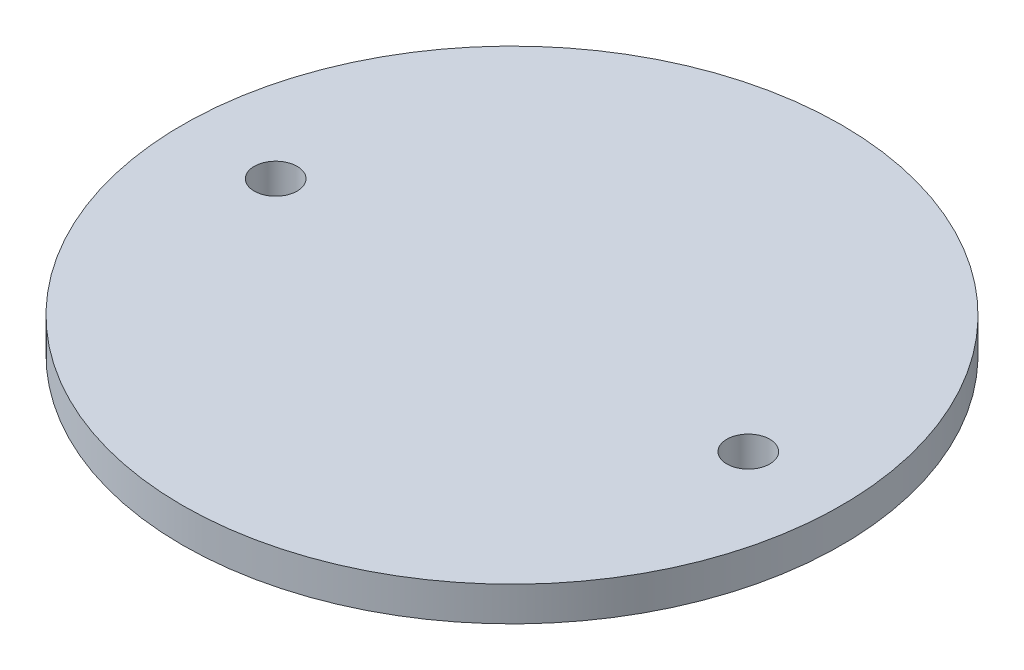
ISO-10303-21;
HEADER;
FILE_DESCRIPTION(('STEP AP214'),'2;1');
FILE_NAME('part.step','',(''),(''),'','','');
FILE_SCHEMA(('AUTOMOTIVE_DESIGN { 1 0 10303 214 1 1 1 1 }'));
ENDSEC;
DATA;
#1=APPLICATION_CONTEXT('core data for automotive mechanical design processes');
#2=APPLICATION_PROTOCOL_DEFINITION('international standard','automotive_design',2000,#1);
#3=PRODUCT_CONTEXT('',#1,'mechanical');
#4=PRODUCT('Part','Part','',(#3));
#5=PRODUCT_RELATED_PRODUCT_CATEGORY('part','',(#4));
#6=PRODUCT_DEFINITION_FORMATION('','',#4);
#7=PRODUCT_DEFINITION_CONTEXT('part definition',#1,'design');
#8=PRODUCT_DEFINITION('design','',#6,#7);
#9=PRODUCT_DEFINITION_SHAPE('','',#8);
#10=(LENGTH_UNIT() NAMED_UNIT(*) SI_UNIT(.MILLI.,.METRE.));
#11=(NAMED_UNIT(*) PLANE_ANGLE_UNIT() SI_UNIT($,.RADIAN.));
#12=(NAMED_UNIT(*) SI_UNIT($,.STERADIAN.) SOLID_ANGLE_UNIT());
#13=UNCERTAINTY_MEASURE_WITH_UNIT(LENGTH_MEASURE(1.E-05),#10,'distance_accuracy_value','');
#14=(GEOMETRIC_REPRESENTATION_CONTEXT(3) GLOBAL_UNCERTAINTY_ASSIGNED_CONTEXT((#13)) GLOBAL_UNIT_ASSIGNED_CONTEXT((#10,
#11,#12)) REPRESENTATION_CONTEXT('',''));
#15=CARTESIAN_POINT('',(0.,0.,0.));
#16=DIRECTION('',(0.,0.,1.));
#17=DIRECTION('',(1.,0.,0.));
#18=AXIS2_PLACEMENT_3D('',#15,#16,#17);
#19=CARTESIAN_POINT('',(0.,4.,0.));
#20=DIRECTION('',(0.,1.,0.));
#21=DIRECTION('',(0.,0.,1.));
#22=AXIS2_PLACEMENT_3D('',#19,#20,#21);
#23=PLANE('',#22);
#24=CARTESIAN_POINT('',(-27.5,4.,0.));
#25=DIRECTION('',(0.,1.,0.));
#26=DIRECTION('',(0.,0.,1.));
#27=AXIS2_PLACEMENT_3D('',#24,#25,#26);
#28=CIRCLE('',#27,2.5);
#29=CARTESIAN_POINT('',(-27.5,4.,2.5));
#30=VERTEX_POINT('',#29);
#31=EDGE_CURVE('E41',#30,#30,#28,.T.);
#32=ORIENTED_EDGE('',*,*,#31,.F.);
#33=EDGE_LOOP('',(#32));
#34=FACE_BOUND('',#33,.T.);
#35=CARTESIAN_POINT('',(0.,4.,0.));
#36=DIRECTION('',(0.,1.,0.));
#37=DIRECTION('',(0.,0.,1.));
#38=AXIS2_PLACEMENT_3D('',#35,#36,#37);
#39=CIRCLE('',#38,38.35);
#40=CARTESIAN_POINT('',(0.,4.,38.35));
#41=VERTEX_POINT('',#40);
#42=EDGE_CURVE('E10',#41,#41,#39,.T.);
#43=ORIENTED_EDGE('',*,*,#42,.T.);
#44=EDGE_LOOP('',(#43));
#45=FACE_BOUND('',#44,.T.);
#46=CARTESIAN_POINT('',(27.5,4.,0.));
#47=DIRECTION('',(0.,1.,0.));
#48=DIRECTION('',(0.,0.,1.));
#49=AXIS2_PLACEMENT_3D('',#46,#47,#48);
#50=CIRCLE('',#49,2.5);
#51=CARTESIAN_POINT('',(27.5,4.,2.49999999999999));
#52=VERTEX_POINT('',#51);
#53=EDGE_CURVE('E46',#52,#52,#50,.T.);
#54=ORIENTED_EDGE('',*,*,#53,.F.);
#55=EDGE_LOOP('',(#54));
#56=FACE_BOUND('',#55,.T.);
#57=ADVANCED_FACE('F30',(#34,#45,#56),#23,.T.);
#58=CARTESIAN_POINT('',(0.,0.,0.));
#59=DIRECTION('',(0.,1.,0.));
#60=DIRECTION('',(0.,0.,1.));
#61=AXIS2_PLACEMENT_3D('',#58,#59,#60);
#62=PLANE('',#61);
#63=CARTESIAN_POINT('',(0.,0.,0.));
#64=DIRECTION('',(0.,1.,0.));
#65=DIRECTION('',(0.,0.,1.));
#66=AXIS2_PLACEMENT_3D('',#63,#64,#65);
#67=CIRCLE('',#66,38.35);
#68=CARTESIAN_POINT('',(0.,0.,38.35));
#69=VERTEX_POINT('',#68);
#70=EDGE_CURVE('E34',#69,#69,#67,.T.);
#71=ORIENTED_EDGE('',*,*,#70,.F.);
#72=EDGE_LOOP('',(#71));
#73=FACE_BOUND('',#72,.T.);
#74=CARTESIAN_POINT('',(-27.5,0.,0.));
#75=DIRECTION('',(0.,1.,0.));
#76=DIRECTION('',(0.,0.,1.));
#77=AXIS2_PLACEMENT_3D('',#74,#75,#76);
#78=CIRCLE('',#77,2.5);
#79=CARTESIAN_POINT('',(-27.5,0.,2.5));
#80=VERTEX_POINT('',#79);
#81=EDGE_CURVE('E43',#80,#80,#78,.T.);
#82=ORIENTED_EDGE('',*,*,#81,.T.);
#83=EDGE_LOOP('',(#82));
#84=FACE_BOUND('',#83,.T.);
#85=CARTESIAN_POINT('',(27.5,0.,0.));
#86=DIRECTION('',(0.,1.,0.));
#87=DIRECTION('',(0.,0.,1.));
#88=AXIS2_PLACEMENT_3D('',#85,#86,#87);
#89=CIRCLE('',#88,2.5);
#90=CARTESIAN_POINT('',(27.5,0.,2.49999999999999));
#91=VERTEX_POINT('',#90);
#92=EDGE_CURVE('E49',#91,#91,#89,.T.);
#93=ORIENTED_EDGE('',*,*,#92,.T.);
#94=EDGE_LOOP('',(#93));
#95=FACE_BOUND('',#94,.T.);
#96=ADVANCED_FACE('F59',(#73,#84,#95),#62,.F.);
#97=CARTESIAN_POINT('',(0.,4.,0.));
#98=DIRECTION('',(0.,-1.,0.));
#99=DIRECTION('',(0.,0.,-1.));
#100=AXIS2_PLACEMENT_3D('',#97,#98,#99);
#101=CYLINDRICAL_SURFACE('',#100,38.35);
#102=ORIENTED_EDGE('',*,*,#42,.F.);
#103=EDGE_LOOP('',(#102));
#104=FACE_BOUND('',#103,.T.);
#105=ORIENTED_EDGE('',*,*,#70,.T.);
#106=EDGE_LOOP('',(#105));
#107=FACE_BOUND('',#106,.T.);
#108=ADVANCED_FACE('F32',(#104,#107),#101,.T.);
#109=CARTESIAN_POINT('',(-27.5,4.,0.));
#110=DIRECTION('',(0.,-1.,0.));
#111=DIRECTION('',(0.,0.,-1.));
#112=AXIS2_PLACEMENT_3D('',#109,#110,#111);
#113=CYLINDRICAL_SURFACE('',#112,2.5);
#114=ORIENTED_EDGE('',*,*,#31,.T.);
#115=EDGE_LOOP('',(#114));
#116=FACE_BOUND('',#115,.T.);
#117=ORIENTED_EDGE('',*,*,#81,.F.);
#118=EDGE_LOOP('',(#117));
#119=FACE_BOUND('',#118,.T.);
#120=ADVANCED_FACE('F68',(#116,#119),#113,.F.);
#121=CARTESIAN_POINT('',(27.5,4.,0.));
#122=DIRECTION('',(0.,-1.,0.));
#123=DIRECTION('',(0.,0.,-1.));
#124=AXIS2_PLACEMENT_3D('',#121,#122,#123);
#125=CYLINDRICAL_SURFACE('',#124,2.5);
#126=ORIENTED_EDGE('',*,*,#53,.T.);
#127=EDGE_LOOP('',(#126));
#128=FACE_BOUND('',#127,.T.);
#129=ORIENTED_EDGE('',*,*,#92,.F.);
#130=EDGE_LOOP('',(#129));
#131=FACE_BOUND('',#130,.T.);
#132=ADVANCED_FACE('F55',(#128,#131),#125,.F.);
#133=CLOSED_SHELL('',(#57,#96,#108,#120,#132));
#134=MANIFOLD_SOLID_BREP('B2',#133);
#135=ADVANCED_BREP_SHAPE_REPRESENTATION('',(#18,#134),#14);
#136=SHAPE_DEFINITION_REPRESENTATION(#9,#135);
ENDSEC;
END-ISO-10303-21;
